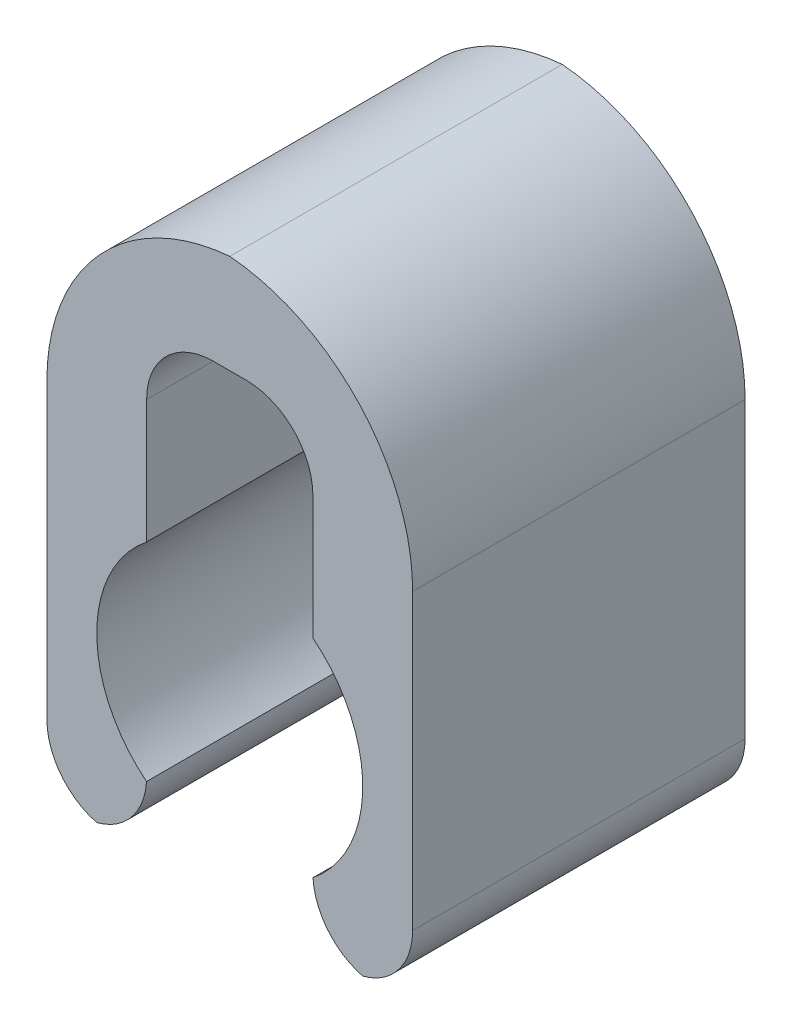
ISO-10303-21;
HEADER;
FILE_DESCRIPTION(('STEP AP214'),'2;1');
FILE_NAME('part.step','',(''),(''),'','','');
FILE_SCHEMA(('AUTOMOTIVE_DESIGN { 1 0 10303 214 1 1 1 1 }'));
ENDSEC;
DATA;
#1=APPLICATION_CONTEXT('core data for automotive mechanical design processes');
#2=APPLICATION_PROTOCOL_DEFINITION('international standard','automotive_design',2000,#1);
#3=PRODUCT_CONTEXT('',#1,'mechanical');
#4=PRODUCT('Part','Part','',(#3));
#5=PRODUCT_RELATED_PRODUCT_CATEGORY('part','',(#4));
#6=PRODUCT_DEFINITION_FORMATION('','',#4);
#7=PRODUCT_DEFINITION_CONTEXT('part definition',#1,'design');
#8=PRODUCT_DEFINITION('design','',#6,#7);
#9=PRODUCT_DEFINITION_SHAPE('','',#8);
#10=(LENGTH_UNIT() NAMED_UNIT(*) SI_UNIT(.MILLI.,.METRE.));
#11=(NAMED_UNIT(*) PLANE_ANGLE_UNIT() SI_UNIT($,.RADIAN.));
#12=(NAMED_UNIT(*) SI_UNIT($,.STERADIAN.) SOLID_ANGLE_UNIT());
#13=UNCERTAINTY_MEASURE_WITH_UNIT(LENGTH_MEASURE(1.E-05),#10,'distance_accuracy_value','');
#14=(GEOMETRIC_REPRESENTATION_CONTEXT(3) GLOBAL_UNCERTAINTY_ASSIGNED_CONTEXT((#13)) GLOBAL_UNIT_ASSIGNED_CONTEXT((#10,
#11,#12)) REPRESENTATION_CONTEXT('',''));
#15=CARTESIAN_POINT('',(0.,0.,0.));
#16=DIRECTION('',(0.,0.,1.));
#17=DIRECTION('',(1.,0.,0.));
#18=AXIS2_PLACEMENT_3D('',#15,#16,#17);
#19=CARTESIAN_POINT('',(-27.1711880482677,0.,10.));
#20=DIRECTION('',(-1.,0.,0.));
#21=DIRECTION('',(0.,0.,1.));
#22=AXIS2_PLACEMENT_3D('',#19,#20,#21);
#23=PLANE('',#22);
#24=DIRECTION('',(0.,1.,0.));
#25=VECTOR('',#24,1.);
#26=CARTESIAN_POINT('',(-27.1711880482677,0.,10.));
#27=LINE('',#26,#25);
#28=CARTESIAN_POINT('',(-27.1711880482677,-1.22540309736089,10.));
#29=VERTEX_POINT('',#28);
#30=CARTESIAN_POINT('',(-27.1711880482677,2.48512818142224,10.));
#31=VERTEX_POINT('',#30);
#32=EDGE_CURVE('E179',#29,#31,#27,.T.);
#33=ORIENTED_EDGE('',*,*,#32,.F.);
#34=DIRECTION('',(0.,0.,1.));
#35=VECTOR('',#34,1.);
#36=CARTESIAN_POINT('',(-27.1711880482677,-1.22540309736089,0.));
#37=LINE('',#36,#35);
#38=CARTESIAN_POINT('',(-27.1711880482677,-1.22540309736089,0.));
#39=VERTEX_POINT('',#38);
#40=EDGE_CURVE('E163',#29,#39,#37,.F.);
#41=ORIENTED_EDGE('',*,*,#40,.T.);
#42=DIRECTION('',(0.,1.,0.));
#43=VECTOR('',#42,1.);
#44=CARTESIAN_POINT('',(-27.1711880482677,0.,0.));
#45=LINE('',#44,#43);
#46=CARTESIAN_POINT('',(-27.1711880482677,2.48512818142224,0.));
#47=VERTEX_POINT('',#46);
#48=EDGE_CURVE('E187',#39,#47,#45,.T.);
#49=ORIENTED_EDGE('',*,*,#48,.T.);
#50=DIRECTION('',(0.,0.,-1.));
#51=VECTOR('',#50,1.);
#52=CARTESIAN_POINT('',(-27.1711880482677,2.48512818142224,10.));
#53=LINE('',#52,#51);
#54=EDGE_CURVE('E274',#47,#31,#53,.F.);
#55=ORIENTED_EDGE('',*,*,#54,.T.);
#56=EDGE_LOOP('',(#33,#41,#49,#55));
#57=FACE_BOUND('',#56,.T.);
#58=ADVANCED_FACE('F43',(#57),#23,.F.);
#59=CARTESIAN_POINT('',(0.,4.48512818142224,10.));
#60=DIRECTION('',(0.,1.,0.));
#61=DIRECTION('',(0.,0.,1.));
#62=AXIS2_PLACEMENT_3D('',#59,#60,#61);
#63=PLANE('',#62);
#64=DIRECTION('',(1.,0.,0.));
#65=VECTOR('',#64,1.);
#66=CARTESIAN_POINT('',(0.,4.48512818142224,10.));
#67=LINE('',#66,#65);
#68=CARTESIAN_POINT('',(-25.1711880482677,4.48512818142224,10.));
#69=VERTEX_POINT('',#68);
#70=CARTESIAN_POINT('',(-24.1711880482677,4.48512818142224,10.));
#71=VERTEX_POINT('',#70);
#72=EDGE_CURVE('E171',#69,#71,#67,.T.);
#73=ORIENTED_EDGE('',*,*,#72,.F.);
#74=DIRECTION('',(0.,0.,-1.));
#75=VECTOR('',#74,1.);
#76=CARTESIAN_POINT('',(-25.1711880482677,4.48512818142224,0.));
#77=LINE('',#76,#75);
#78=CARTESIAN_POINT('',(-25.1711880482677,4.48512818142224,0.));
#79=VERTEX_POINT('',#78);
#80=EDGE_CURVE('E270',#69,#79,#77,.T.);
#81=ORIENTED_EDGE('',*,*,#80,.T.);
#82=DIRECTION('',(1.,0.,0.));
#83=VECTOR('',#82,1.);
#84=CARTESIAN_POINT('',(0.,4.48512818142224,0.));
#85=LINE('',#84,#83);
#86=CARTESIAN_POINT('',(-24.1711880482677,4.48512818142224,0.));
#87=VERTEX_POINT('',#86);
#88=EDGE_CURVE('E190',#79,#87,#85,.T.);
#89=ORIENTED_EDGE('',*,*,#88,.T.);
#90=DIRECTION('',(0.,0.,-1.));
#91=VECTOR('',#90,1.);
#92=CARTESIAN_POINT('',(-24.1711880482677,4.48512818142224,10.));
#93=LINE('',#92,#91);
#94=EDGE_CURVE('E260',#87,#71,#93,.F.);
#95=ORIENTED_EDGE('',*,*,#94,.T.);
#96=EDGE_LOOP('',(#73,#81,#89,#95));
#97=FACE_BOUND('',#96,.T.);
#98=ADVANCED_FACE('F349',(#97),#63,.F.);
#99=CARTESIAN_POINT('',(-22.1711880482677,0.,10.));
#100=DIRECTION('',(-1.,0.,0.));
#101=DIRECTION('',(0.,0.,1.));
#102=AXIS2_PLACEMENT_3D('',#99,#100,#101);
#103=PLANE('',#102);
#104=DIRECTION('',(0.,0.,1.));
#105=VECTOR('',#104,1.);
#106=CARTESIAN_POINT('',(-22.1711880482677,-1.2254030973609,0.));
#107=LINE('',#106,#105);
#108=CARTESIAN_POINT('',(-22.1711880482677,-1.2254030973609,10.));
#109=VERTEX_POINT('',#108);
#110=CARTESIAN_POINT('',(-22.1711880482677,-1.2254030973609,0.));
#111=VERTEX_POINT('',#110);
#112=EDGE_CURVE('E150',#109,#111,#107,.F.);
#113=ORIENTED_EDGE('',*,*,#112,.F.);
#114=DIRECTION('',(0.,1.,0.));
#115=VECTOR('',#114,1.);
#116=CARTESIAN_POINT('',(-22.1711880482677,0.,10.));
#117=LINE('',#116,#115);
#118=CARTESIAN_POINT('',(-22.1711880482677,2.48512818142224,10.));
#119=VERTEX_POINT('',#118);
#120=EDGE_CURVE('E160',#109,#119,#117,.T.);
#121=ORIENTED_EDGE('',*,*,#120,.T.);
#122=DIRECTION('',(0.,0.,-1.));
#123=VECTOR('',#122,1.);
#124=CARTESIAN_POINT('',(-22.1711880482677,2.48512818142224,10.));
#125=LINE('',#124,#123);
#126=CARTESIAN_POINT('',(-22.1711880482677,2.48512818142224,0.));
#127=VERTEX_POINT('',#126);
#128=EDGE_CURVE('E278',#119,#127,#125,.T.);
#129=ORIENTED_EDGE('',*,*,#128,.T.);
#130=DIRECTION('',(0.,1.,0.));
#131=VECTOR('',#130,1.);
#132=CARTESIAN_POINT('',(-22.1711880482677,0.,0.));
#133=LINE('',#132,#131);
#134=EDGE_CURVE('E162',#111,#127,#133,.T.);
#135=ORIENTED_EDGE('',*,*,#134,.F.);
#136=EDGE_LOOP('',(#113,#121,#129,#135));
#137=FACE_BOUND('',#136,.T.);
#138=ADVANCED_FACE('F158',(#137),#103,.T.);
#139=CARTESIAN_POINT('',(-19.1711880482677,0.,10.));
#140=DIRECTION('',(1.,0.,0.));
#141=DIRECTION('',(0.,1.,0.));
#142=AXIS2_PLACEMENT_3D('',#139,#140,#141);
#143=PLANE('',#142);
#144=DIRECTION('',(0.,-1.,0.));
#145=VECTOR('',#144,1.);
#146=CARTESIAN_POINT('',(-19.1711880482677,0.,10.));
#147=LINE('',#146,#145);
#148=CARTESIAN_POINT('',(-19.1711880482677,1.48512818142224,10.));
#149=VERTEX_POINT('',#148);
#150=CARTESIAN_POINT('',(-19.1711880482677,-7.34790209656009,10.));
#151=VERTEX_POINT('',#150);
#152=EDGE_CURVE('E170',#149,#151,#147,.T.);
#153=ORIENTED_EDGE('',*,*,#152,.T.);
#154=DIRECTION('',(0.,0.,-1.));
#155=VECTOR('',#154,1.);
#156=CARTESIAN_POINT('',(-19.1711880482677,-7.34790209656009,0.));
#157=LINE('',#156,#155);
#158=CARTESIAN_POINT('',(-19.1711880482677,-7.34790209656009,0.));
#159=VERTEX_POINT('',#158);
#160=EDGE_CURVE('E223',#151,#159,#157,.T.);
#161=ORIENTED_EDGE('',*,*,#160,.T.);
#162=DIRECTION('',(0.,-1.,0.));
#163=VECTOR('',#162,1.);
#164=CARTESIAN_POINT('',(-19.1711880482677,0.,0.));
#165=LINE('',#164,#163);
#166=CARTESIAN_POINT('',(-19.1711880482677,1.48512818142224,0.));
#167=VERTEX_POINT('',#166);
#168=EDGE_CURVE('E197',#167,#159,#165,.T.);
#169=ORIENTED_EDGE('',*,*,#168,.F.);
#170=DIRECTION('',(0.,0.,-1.));
#171=VECTOR('',#170,1.);
#172=CARTESIAN_POINT('',(-19.1711880482677,1.48512818142224,10.));
#173=LINE('',#172,#171);
#174=EDGE_CURVE('E210',#167,#149,#173,.F.);
#175=ORIENTED_EDGE('',*,*,#174,.T.);
#176=EDGE_LOOP('',(#153,#161,#169,#175));
#177=FACE_BOUND('',#176,.T.);
#178=ADVANCED_FACE('F326',(#177),#143,.T.);
#179=CARTESIAN_POINT('',(-30.1711880482677,0.,10.));
#180=DIRECTION('',(1.,0.,0.));
#181=DIRECTION('',(0.,1.,0.));
#182=AXIS2_PLACEMENT_3D('',#179,#180,#181);
#183=PLANE('',#182);
#184=DIRECTION('',(0.,-1.,0.));
#185=VECTOR('',#184,1.);
#186=CARTESIAN_POINT('',(-30.1711880482677,0.,0.));
#187=LINE('',#186,#185);
#188=CARTESIAN_POINT('',(-30.1711880482677,1.48512818142224,0.));
#189=VERTEX_POINT('',#188);
#190=CARTESIAN_POINT('',(-30.1711880482677,-7.34790209656009,0.));
#191=VERTEX_POINT('',#190);
#192=EDGE_CURVE('E201',#189,#191,#187,.T.);
#193=ORIENTED_EDGE('',*,*,#192,.T.);
#194=DIRECTION('',(0.,0.,-1.));
#195=VECTOR('',#194,1.);
#196=CARTESIAN_POINT('',(-30.1711880482677,-7.34790209656009,10.));
#197=LINE('',#196,#195);
#198=CARTESIAN_POINT('',(-30.1711880482677,-7.34790209656009,10.));
#199=VERTEX_POINT('',#198);
#200=EDGE_CURVE('E257',#191,#199,#197,.F.);
#201=ORIENTED_EDGE('',*,*,#200,.T.);
#202=DIRECTION('',(0.,-1.,0.));
#203=VECTOR('',#202,1.);
#204=CARTESIAN_POINT('',(-30.1711880482677,0.,10.));
#205=LINE('',#204,#203);
#206=CARTESIAN_POINT('',(-30.1711880482677,1.48512818142224,10.));
#207=VERTEX_POINT('',#206);
#208=EDGE_CURVE('E176',#207,#199,#205,.T.);
#209=ORIENTED_EDGE('',*,*,#208,.F.);
#210=DIRECTION('',(0.,0.,-1.));
#211=VECTOR('',#210,1.);
#212=CARTESIAN_POINT('',(-30.1711880482677,1.48512818142224,0.));
#213=LINE('',#212,#211);
#214=EDGE_CURVE('E220',#207,#189,#213,.T.);
#215=ORIENTED_EDGE('',*,*,#214,.T.);
#216=EDGE_LOOP('',(#193,#201,#209,#215));
#217=FACE_BOUND('',#216,.T.);
#218=ADVANCED_FACE('F314',(#217),#183,.F.);
#219=CARTESIAN_POINT('',(0.,0.,10.));
#220=DIRECTION('',(0.,0.,1.));
#221=DIRECTION('',(1.,0.,0.));
#222=AXIS2_PLACEMENT_3D('',#219,#220,#221);
#223=PLANE('',#222);
#224=CARTESIAN_POINT('',(-24.6711880482677,-4.34790209656009,10.));
#225=DIRECTION('',(0.,0.,1.));
#226=DIRECTION('',(1.,0.,0.));
#227=AXIS2_PLACEMENT_3D('',#224,#225,#226);
#228=CIRCLE('',#227,4.);
#229=CARTESIAN_POINT('',(-27.1747690026704,-7.46753066495601,10.));
#230=VERTEX_POINT('',#229);
#231=EDGE_CURVE('E65',#29,#230,#228,.T.);
#232=ORIENTED_EDGE('',*,*,#231,.F.);
#233=ORIENTED_EDGE('',*,*,#32,.T.);
#234=CARTESIAN_POINT('',(-25.1711880482677,2.48512818142224,10.));
#235=DIRECTION('',(0.,0.,1.));
#236=DIRECTION('',(1.,0.,0.));
#237=AXIS2_PLACEMENT_3D('',#234,#235,#236);
#238=CIRCLE('',#237,2.);
#239=EDGE_CURVE('E285',#31,#69,#238,.F.);
#240=ORIENTED_EDGE('',*,*,#239,.T.);
#241=ORIENTED_EDGE('',*,*,#72,.T.);
#242=CARTESIAN_POINT('',(-24.1711880482677,2.48512818142224,10.));
#243=DIRECTION('',(0.,0.,1.));
#244=DIRECTION('',(1.,0.,0.));
#245=AXIS2_PLACEMENT_3D('',#242,#243,#244);
#246=CIRCLE('',#245,2.);
#247=EDGE_CURVE('E51',#71,#119,#246,.F.);
#248=ORIENTED_EDGE('',*,*,#247,.T.);
#249=ORIENTED_EDGE('',*,*,#120,.F.);
#250=CARTESIAN_POINT('',(-22.1676070938649,-7.46753066495601,10.));
#251=VERTEX_POINT('',#250);
#252=EDGE_CURVE('E147',#251,#109,#228,.T.);
#253=ORIENTED_EDGE('',*,*,#252,.F.);
#254=CARTESIAN_POINT('',(-20.1711880482677,-7.34790209656009,10.));
#255=DIRECTION('',(0.,0.,1.));
#256=DIRECTION('',(1.,0.,0.));
#257=AXIS2_PLACEMENT_3D('',#254,#255,#256);
#258=CIRCLE('',#257,2.);
#259=CARTESIAN_POINT('',(-20.6711880482677,-9.2843937696638,10.));
#260=VERTEX_POINT('',#259);
#261=EDGE_CURVE('E251',#251,#260,#258,.T.);
#262=ORIENTED_EDGE('',*,*,#261,.T.);
#263=CARTESIAN_POINT('',(-21.1711880482677,-7.34790209656009,10.));
#264=DIRECTION('',(0.,0.,1.));
#265=DIRECTION('',(1.,0.,0.));
#266=AXIS2_PLACEMENT_3D('',#263,#264,#265);
#267=CIRCLE('',#266,2.);
#268=EDGE_CURVE('E254',#260,#151,#267,.T.);
#269=ORIENTED_EDGE('',*,*,#268,.T.);
#270=ORIENTED_EDGE('',*,*,#152,.F.);
#271=CARTESIAN_POINT('',(-25.1711880482677,1.48512818142224,10.));
#272=DIRECTION('',(0.,0.,1.));
#273=DIRECTION('',(1.,0.,0.));
#274=AXIS2_PLACEMENT_3D('',#271,#272,#273);
#275=CIRCLE('',#274,6.);
#276=CARTESIAN_POINT('',(-24.6711880482677,7.46425855297294,10.));
#277=VERTEX_POINT('',#276);
#278=EDGE_CURVE('E217',#149,#277,#275,.T.);
#279=ORIENTED_EDGE('',*,*,#278,.T.);
#280=CARTESIAN_POINT('',(-24.1711880482677,1.48512818142224,10.));
#281=DIRECTION('',(0.,0.,1.));
#282=DIRECTION('',(1.,0.,0.));
#283=AXIS2_PLACEMENT_3D('',#280,#281,#282);
#284=CIRCLE('',#283,6.);
#285=EDGE_CURVE('E214',#277,#207,#284,.T.);
#286=ORIENTED_EDGE('',*,*,#285,.T.);
#287=ORIENTED_EDGE('',*,*,#208,.T.);
#288=CARTESIAN_POINT('',(-28.1711880482677,-7.34790209656009,10.));
#289=DIRECTION('',(0.,0.,1.));
#290=DIRECTION('',(1.,0.,0.));
#291=AXIS2_PLACEMENT_3D('',#288,#289,#290);
#292=CIRCLE('',#291,2.);
#293=CARTESIAN_POINT('',(-28.6711880482677,-9.2843937696638,10.));
#294=VERTEX_POINT('',#293);
#295=EDGE_CURVE('E244',#199,#294,#292,.T.);
#296=ORIENTED_EDGE('',*,*,#295,.T.);
#297=CARTESIAN_POINT('',(-29.1711880482677,-7.34790209656009,10.));
#298=DIRECTION('',(0.,0.,1.));
#299=DIRECTION('',(1.,0.,0.));
#300=AXIS2_PLACEMENT_3D('',#297,#298,#299);
#301=CIRCLE('',#300,2.);
#302=EDGE_CURVE('E247',#294,#230,#301,.T.);
#303=ORIENTED_EDGE('',*,*,#302,.T.);
#304=EDGE_LOOP('',(#232,#233,#240,#241,#248,#249,#253,#262,#269,#270,#279,#286,#287,#296,#303));
#305=FACE_BOUND('',#304,.T.);
#306=ADVANCED_FACE('F165',(#305),#223,.T.);
#307=CARTESIAN_POINT('',(0.,0.,0.));
#308=DIRECTION('',(0.,0.,1.));
#309=DIRECTION('',(1.,0.,0.));
#310=AXIS2_PLACEMENT_3D('',#307,#308,#309);
#311=PLANE('',#310);
#312=ORIENTED_EDGE('',*,*,#48,.F.);
#313=CARTESIAN_POINT('',(-24.6711880482677,-4.34790209656009,0.));
#314=DIRECTION('',(0.,0.,1.));
#315=DIRECTION('',(1.,0.,0.));
#316=AXIS2_PLACEMENT_3D('',#313,#314,#315);
#317=CIRCLE('',#316,4.);
#318=CARTESIAN_POINT('',(-27.1747690026704,-7.46753066495601,0.));
#319=VERTEX_POINT('',#318);
#320=EDGE_CURVE('E295',#39,#319,#317,.T.);
#321=ORIENTED_EDGE('',*,*,#320,.T.);
#322=CARTESIAN_POINT('',(-29.1711880482677,-7.34790209656009,0.));
#323=DIRECTION('',(0.,0.,1.));
#324=DIRECTION('',(1.,0.,0.));
#325=AXIS2_PLACEMENT_3D('',#322,#323,#324);
#326=CIRCLE('',#325,2.);
#327=CARTESIAN_POINT('',(-28.6711880482677,-9.2843937696638,0.));
#328=VERTEX_POINT('',#327);
#329=EDGE_CURVE('E234',#319,#328,#326,.F.);
#330=ORIENTED_EDGE('',*,*,#329,.T.);
#331=CARTESIAN_POINT('',(-28.1711880482677,-7.34790209656009,0.));
#332=DIRECTION('',(0.,0.,1.));
#333=DIRECTION('',(1.,0.,0.));
#334=AXIS2_PLACEMENT_3D('',#331,#332,#333);
#335=CIRCLE('',#334,2.);
#336=EDGE_CURVE('E231',#328,#191,#335,.F.);
#337=ORIENTED_EDGE('',*,*,#336,.T.);
#338=ORIENTED_EDGE('',*,*,#192,.F.);
#339=CARTESIAN_POINT('',(-24.1711880482677,1.48512818142224,0.));
#340=DIRECTION('',(0.,0.,1.));
#341=DIRECTION('',(1.,0.,0.));
#342=AXIS2_PLACEMENT_3D('',#339,#340,#341);
#343=CIRCLE('',#342,6.);
#344=CARTESIAN_POINT('',(-24.6711880482677,7.46425855297294,0.));
#345=VERTEX_POINT('',#344);
#346=EDGE_CURVE('E186',#189,#345,#343,.F.);
#347=ORIENTED_EDGE('',*,*,#346,.T.);
#348=CARTESIAN_POINT('',(-25.1711880482677,1.48512818142224,0.));
#349=DIRECTION('',(0.,0.,1.));
#350=DIRECTION('',(1.,0.,0.));
#351=AXIS2_PLACEMENT_3D('',#348,#349,#350);
#352=CIRCLE('',#351,6.);
#353=EDGE_CURVE('E207',#345,#167,#352,.F.);
#354=ORIENTED_EDGE('',*,*,#353,.T.);
#355=ORIENTED_EDGE('',*,*,#168,.T.);
#356=CARTESIAN_POINT('',(-21.1711880482677,-7.34790209656009,0.));
#357=DIRECTION('',(0.,0.,1.));
#358=DIRECTION('',(1.,0.,0.));
#359=AXIS2_PLACEMENT_3D('',#356,#357,#358);
#360=CIRCLE('',#359,2.);
#361=CARTESIAN_POINT('',(-20.6711880482677,-9.2843937696638,0.));
#362=VERTEX_POINT('',#361);
#363=EDGE_CURVE('E241',#159,#362,#360,.F.);
#364=ORIENTED_EDGE('',*,*,#363,.T.);
#365=CARTESIAN_POINT('',(-20.1711880482677,-7.34790209656009,0.));
#366=DIRECTION('',(0.,0.,1.));
#367=DIRECTION('',(1.,0.,0.));
#368=AXIS2_PLACEMENT_3D('',#365,#366,#367);
#369=CIRCLE('',#368,2.);
#370=CARTESIAN_POINT('',(-22.1676070938649,-7.46753066495601,0.));
#371=VERTEX_POINT('',#370);
#372=EDGE_CURVE('E237',#362,#371,#369,.F.);
#373=ORIENTED_EDGE('',*,*,#372,.T.);
#374=EDGE_CURVE('E58',#371,#111,#317,.T.);
#375=ORIENTED_EDGE('',*,*,#374,.T.);
#376=ORIENTED_EDGE('',*,*,#134,.T.);
#377=CARTESIAN_POINT('',(-24.1711880482677,2.48512818142224,0.));
#378=DIRECTION('',(0.,0.,1.));
#379=DIRECTION('',(1.,0.,0.));
#380=AXIS2_PLACEMENT_3D('',#377,#378,#379);
#381=CIRCLE('',#380,2.);
#382=EDGE_CURVE('E288',#127,#87,#381,.T.);
#383=ORIENTED_EDGE('',*,*,#382,.T.);
#384=ORIENTED_EDGE('',*,*,#88,.F.);
#385=CARTESIAN_POINT('',(-25.1711880482677,2.48512818142224,0.));
#386=DIRECTION('',(0.,0.,1.));
#387=DIRECTION('',(1.,0.,0.));
#388=AXIS2_PLACEMENT_3D('',#385,#386,#387);
#389=CIRCLE('',#388,2.);
#390=EDGE_CURVE('E281',#79,#47,#389,.T.);
#391=ORIENTED_EDGE('',*,*,#390,.T.);
#392=EDGE_LOOP('',(#312,#321,#330,#337,#338,#347,#354,#355,#364,#373,#375,#376,#383,#384,#391));
#393=FACE_BOUND('',#392,.T.);
#394=ADVANCED_FACE('F301',(#393),#311,.F.);
#395=CARTESIAN_POINT('',(-24.1711880482677,1.48512818142224,10.));
#396=DIRECTION('',(0.,0.,1.));
#397=DIRECTION('',(1.,0.,0.));
#398=AXIS2_PLACEMENT_3D('',#395,#396,#397);
#399=CYLINDRICAL_SURFACE('',#398,6.);
#400=ORIENTED_EDGE('',*,*,#214,.F.);
#401=ORIENTED_EDGE('',*,*,#285,.F.);
#402=DIRECTION('',(0.,0.,1.));
#403=VECTOR('',#402,1.);
#404=CARTESIAN_POINT('',(-24.6711880482677,7.46425855297294,5.));
#405=LINE('',#404,#403);
#406=EDGE_CURVE('E191',#345,#277,#405,.T.);
#407=ORIENTED_EDGE('',*,*,#406,.F.);
#408=ORIENTED_EDGE('',*,*,#346,.F.);
#409=EDGE_LOOP('',(#400,#401,#407,#408));
#410=FACE_BOUND('',#409,.T.);
#411=ADVANCED_FACE('F319',(#410),#399,.T.);
#412=CARTESIAN_POINT('',(-25.1711880482677,1.48512818142224,10.));
#413=DIRECTION('',(0.,0.,-1.));
#414=DIRECTION('',(-1.,0.,0.));
#415=AXIS2_PLACEMENT_3D('',#412,#413,#414);
#416=CYLINDRICAL_SURFACE('',#415,6.);
#417=ORIENTED_EDGE('',*,*,#278,.F.);
#418=ORIENTED_EDGE('',*,*,#174,.F.);
#419=ORIENTED_EDGE('',*,*,#353,.F.);
#420=ORIENTED_EDGE('',*,*,#406,.T.);
#421=EDGE_LOOP('',(#417,#418,#419,#420));
#422=FACE_BOUND('',#421,.T.);
#423=ADVANCED_FACE('F329',(#422),#416,.T.);
#424=CARTESIAN_POINT('',(-20.1711880482677,-7.34790209656009,10.));
#425=DIRECTION('',(0.,0.,-1.));
#426=DIRECTION('',(-1.,0.,0.));
#427=AXIS2_PLACEMENT_3D('',#424,#425,#426);
#428=CYLINDRICAL_SURFACE('',#427,2.);
#429=DIRECTION('',(0.,0.,1.));
#430=VECTOR('',#429,1.);
#431=CARTESIAN_POINT('',(-22.1676070938649,-7.46753066495601,5.));
#432=LINE('',#431,#430);
#433=EDGE_CURVE('E151',#371,#251,#432,.T.);
#434=ORIENTED_EDGE('',*,*,#433,.F.);
#435=ORIENTED_EDGE('',*,*,#372,.F.);
#436=DIRECTION('',(0.,0.,-1.));
#437=VECTOR('',#436,1.);
#438=CARTESIAN_POINT('',(-20.6711880482677,-9.2843937696638,5.));
#439=LINE('',#438,#437);
#440=EDGE_CURVE('E227',#260,#362,#439,.T.);
#441=ORIENTED_EDGE('',*,*,#440,.F.);
#442=ORIENTED_EDGE('',*,*,#261,.F.);
#443=EDGE_LOOP('',(#434,#435,#441,#442));
#444=FACE_BOUND('',#443,.T.);
#445=ADVANCED_FACE('F336',(#444),#428,.T.);
#446=CARTESIAN_POINT('',(-21.1711880482677,-7.34790209656009,10.));
#447=DIRECTION('',(0.,0.,1.));
#448=DIRECTION('',(1.,0.,0.));
#449=AXIS2_PLACEMENT_3D('',#446,#447,#448);
#450=CYLINDRICAL_SURFACE('',#449,2.);
#451=ORIENTED_EDGE('',*,*,#268,.F.);
#452=ORIENTED_EDGE('',*,*,#440,.T.);
#453=ORIENTED_EDGE('',*,*,#363,.F.);
#454=ORIENTED_EDGE('',*,*,#160,.F.);
#455=EDGE_LOOP('',(#451,#452,#453,#454));
#456=FACE_BOUND('',#455,.T.);
#457=ADVANCED_FACE('F332',(#456),#450,.T.);
#458=CARTESIAN_POINT('',(-28.1711880482677,-7.34790209656009,10.));
#459=DIRECTION('',(0.,0.,-1.));
#460=DIRECTION('',(-1.,0.,0.));
#461=AXIS2_PLACEMENT_3D('',#458,#459,#460);
#462=CYLINDRICAL_SURFACE('',#461,2.);
#463=DIRECTION('',(0.,0.,-1.));
#464=VECTOR('',#463,1.);
#465=CARTESIAN_POINT('',(-28.6711880482677,-9.2843937696638,5.));
#466=LINE('',#465,#464);
#467=EDGE_CURVE('E264',#294,#328,#466,.T.);
#468=ORIENTED_EDGE('',*,*,#467,.F.);
#469=ORIENTED_EDGE('',*,*,#295,.F.);
#470=ORIENTED_EDGE('',*,*,#200,.F.);
#471=ORIENTED_EDGE('',*,*,#336,.F.);
#472=EDGE_LOOP('',(#468,#469,#470,#471));
#473=FACE_BOUND('',#472,.T.);
#474=ADVANCED_FACE('F309',(#473),#462,.T.);
#475=CARTESIAN_POINT('',(-29.1711880482677,-7.34790209656009,10.));
#476=DIRECTION('',(0.,0.,1.));
#477=DIRECTION('',(1.,0.,0.));
#478=AXIS2_PLACEMENT_3D('',#475,#476,#477);
#479=CYLINDRICAL_SURFACE('',#478,2.);
#480=DIRECTION('',(0.,0.,1.));
#481=VECTOR('',#480,1.);
#482=CARTESIAN_POINT('',(-27.1747690026704,-7.46753066495601,5.));
#483=LINE('',#482,#481);
#484=EDGE_CURVE('E11',#230,#319,#483,.F.);
#485=ORIENTED_EDGE('',*,*,#484,.F.);
#486=ORIENTED_EDGE('',*,*,#302,.F.);
#487=ORIENTED_EDGE('',*,*,#467,.T.);
#488=ORIENTED_EDGE('',*,*,#329,.F.);
#489=EDGE_LOOP('',(#485,#486,#487,#488));
#490=FACE_BOUND('',#489,.T.);
#491=ADVANCED_FACE('F304',(#490),#479,.T.);
#492=CARTESIAN_POINT('',(-25.1711880482677,2.48512818142224,10.));
#493=DIRECTION('',(0.,0.,1.));
#494=DIRECTION('',(1.,0.,0.));
#495=AXIS2_PLACEMENT_3D('',#492,#493,#494);
#496=CYLINDRICAL_SURFACE('',#495,2.);
#497=ORIENTED_EDGE('',*,*,#239,.F.);
#498=ORIENTED_EDGE('',*,*,#54,.F.);
#499=ORIENTED_EDGE('',*,*,#390,.F.);
#500=ORIENTED_EDGE('',*,*,#80,.F.);
#501=EDGE_LOOP('',(#497,#498,#499,#500));
#502=FACE_BOUND('',#501,.T.);
#503=ADVANCED_FACE('F422',(#502),#496,.F.);
#504=CARTESIAN_POINT('',(-24.1711880482677,2.48512818142224,10.));
#505=DIRECTION('',(0.,0.,-1.));
#506=DIRECTION('',(-1.,0.,0.));
#507=AXIS2_PLACEMENT_3D('',#504,#505,#506);
#508=CYLINDRICAL_SURFACE('',#507,2.);
#509=ORIENTED_EDGE('',*,*,#247,.F.);
#510=ORIENTED_EDGE('',*,*,#94,.F.);
#511=ORIENTED_EDGE('',*,*,#382,.F.);
#512=ORIENTED_EDGE('',*,*,#128,.F.);
#513=EDGE_LOOP('',(#509,#510,#511,#512));
#514=FACE_BOUND('',#513,.T.);
#515=ADVANCED_FACE('F45',(#514),#508,.F.);
#516=CARTESIAN_POINT('',(-24.6711880482677,-4.34790209656009,0.));
#517=DIRECTION('',(0.,0.,1.));
#518=DIRECTION('',(1.,0.,0.));
#519=AXIS2_PLACEMENT_3D('',#516,#517,#518);
#520=CYLINDRICAL_SURFACE('',#519,4.);
#521=ORIENTED_EDGE('',*,*,#231,.T.);
#522=ORIENTED_EDGE('',*,*,#484,.T.);
#523=ORIENTED_EDGE('',*,*,#320,.F.);
#524=ORIENTED_EDGE('',*,*,#40,.F.);
#525=EDGE_LOOP('',(#521,#522,#523,#524));
#526=FACE_BOUND('',#525,.T.);
#527=ADVANCED_FACE('F434',(#526),#520,.F.);
#528=ORIENTED_EDGE('',*,*,#112,.T.);
#529=ORIENTED_EDGE('',*,*,#374,.F.);
#530=ORIENTED_EDGE('',*,*,#433,.T.);
#531=ORIENTED_EDGE('',*,*,#252,.T.);
#532=EDGE_LOOP('',(#528,#529,#530,#531));
#533=FACE_BOUND('',#532,.T.);
#534=ADVANCED_FACE('F149',(#533),#520,.F.);
#535=CLOSED_SHELL('',(#58,#98,#138,#178,#218,#306,#394,#411,#423,#445,#457,#474,#491,#503,#515,
#527,#534));
#536=MANIFOLD_SOLID_BREP('B2',#535);
#537=ADVANCED_BREP_SHAPE_REPRESENTATION('',(#18,#536),#14);
#538=SHAPE_DEFINITION_REPRESENTATION(#9,#537);
ENDSEC;
END-ISO-10303-21;
